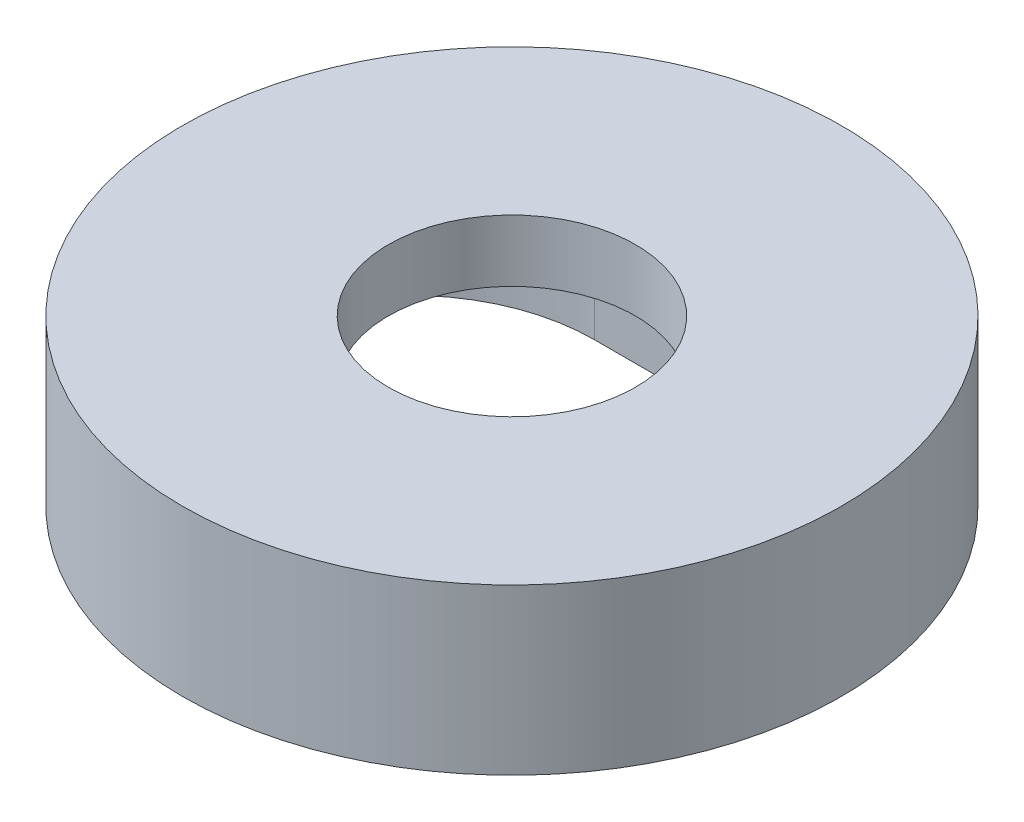
ISO-10303-21;
HEADER;
FILE_DESCRIPTION(('STEP AP214'),'2;1');
FILE_NAME('part.step','',(''),(''),'','','');
FILE_SCHEMA(('AUTOMOTIVE_DESIGN { 1 0 10303 214 1 1 1 1 }'));
ENDSEC;
DATA;
#1=APPLICATION_CONTEXT('core data for automotive mechanical design processes');
#2=APPLICATION_PROTOCOL_DEFINITION('international standard','automotive_design',2000,#1);
#3=PRODUCT_CONTEXT('',#1,'mechanical');
#4=PRODUCT('Part','Part','',(#3));
#5=PRODUCT_RELATED_PRODUCT_CATEGORY('part','',(#4));
#6=PRODUCT_DEFINITION_FORMATION('','',#4);
#7=PRODUCT_DEFINITION_CONTEXT('part definition',#1,'design');
#8=PRODUCT_DEFINITION('design','',#6,#7);
#9=PRODUCT_DEFINITION_SHAPE('','',#8);
#10=(LENGTH_UNIT() NAMED_UNIT(*) SI_UNIT(.MILLI.,.METRE.));
#11=(NAMED_UNIT(*) PLANE_ANGLE_UNIT() SI_UNIT($,.RADIAN.));
#12=(NAMED_UNIT(*) SI_UNIT($,.STERADIAN.) SOLID_ANGLE_UNIT());
#13=UNCERTAINTY_MEASURE_WITH_UNIT(LENGTH_MEASURE(1.E-05),#10,'distance_accuracy_value','');
#14=(GEOMETRIC_REPRESENTATION_CONTEXT(3) GLOBAL_UNCERTAINTY_ASSIGNED_CONTEXT((#13)) GLOBAL_UNIT_ASSIGNED_CONTEXT((#10,
#11,#12)) REPRESENTATION_CONTEXT('',''));
#15=CARTESIAN_POINT('',(0.,0.,0.));
#16=DIRECTION('',(0.,0.,1.));
#17=DIRECTION('',(1.,0.,0.));
#18=AXIS2_PLACEMENT_3D('',#15,#16,#17);
#19=CARTESIAN_POINT('',(0.,0.,0.));
#20=DIRECTION('',(0.,1.,0.));
#21=DIRECTION('',(0.,0.,1.));
#22=AXIS2_PLACEMENT_3D('',#19,#20,#21);
#23=PLANE('',#22);
#24=CARTESIAN_POINT('',(0.,0.,0.));
#25=DIRECTION('',(0.,1.,0.));
#26=DIRECTION('',(0.,0.,1.));
#27=AXIS2_PLACEMENT_3D('',#24,#25,#26);
#28=CIRCLE('',#27,16.);
#29=CARTESIAN_POINT('',(0.,0.,16.));
#30=VERTEX_POINT('',#29);
#31=EDGE_CURVE('E44',#30,#30,#28,.T.);
#32=ORIENTED_EDGE('',*,*,#31,.F.);
#33=EDGE_LOOP('',(#32));
#34=FACE_BOUND('',#33,.T.);
#35=CARTESIAN_POINT('',(-5.,0.,0.));
#36=DIRECTION('',(0.,1.,0.));
#37=DIRECTION('',(0.,0.,1.));
#38=AXIS2_PLACEMENT_3D('',#35,#36,#37);
#39=CIRCLE('',#38,9.);
#40=CARTESIAN_POINT('',(-5.,0.,-9.));
#41=VERTEX_POINT('',#40);
#42=CARTESIAN_POINT('',(-5.,0.,9.));
#43=VERTEX_POINT('',#42);
#44=EDGE_CURVE('E52',#41,#43,#39,.T.);
#45=ORIENTED_EDGE('',*,*,#44,.T.);
#46=DIRECTION('',(1.,0.,0.));
#47=VECTOR('',#46,1.);
#48=CARTESIAN_POINT('',(-5.,0.,9.));
#49=LINE('',#48,#47);
#50=CARTESIAN_POINT('',(5.,0.,9.));
#51=VERTEX_POINT('',#50);
#52=EDGE_CURVE('E107',#43,#51,#49,.T.);
#53=ORIENTED_EDGE('',*,*,#52,.T.);
#54=CARTESIAN_POINT('',(5.,0.,0.));
#55=DIRECTION('',(0.,1.,0.));
#56=DIRECTION('',(0.,0.,1.));
#57=AXIS2_PLACEMENT_3D('',#54,#55,#56);
#58=CIRCLE('',#57,9.);
#59=CARTESIAN_POINT('',(5.,0.,-9.));
#60=VERTEX_POINT('',#59);
#61=EDGE_CURVE('E97',#51,#60,#58,.T.);
#62=ORIENTED_EDGE('',*,*,#61,.T.);
#63=DIRECTION('',(-1.,0.,0.));
#64=VECTOR('',#63,1.);
#65=CARTESIAN_POINT('',(-5.,0.,-9.));
#66=LINE('',#65,#64);
#67=EDGE_CURVE('E110',#60,#41,#66,.T.);
#68=ORIENTED_EDGE('',*,*,#67,.T.);
#69=EDGE_LOOP('',(#45,#53,#62,#68));
#70=FACE_BOUND('',#69,.T.);
#71=ADVANCED_FACE('F35',(#34,#70),#23,.F.);
#72=CARTESIAN_POINT('',(0.,8.,0.));
#73=DIRECTION('',(0.,-1.,0.));
#74=DIRECTION('',(0.,0.,-1.));
#75=AXIS2_PLACEMENT_3D('',#72,#73,#74);
#76=CYLINDRICAL_SURFACE('',#75,16.);
#77=CARTESIAN_POINT('',(0.,8.,0.));
#78=DIRECTION('',(0.,1.,0.));
#79=DIRECTION('',(0.,0.,1.));
#80=AXIS2_PLACEMENT_3D('',#77,#78,#79);
#81=CIRCLE('',#80,16.);
#82=CARTESIAN_POINT('',(0.,8.,16.));
#83=VERTEX_POINT('',#82);
#84=EDGE_CURVE('E11',#83,#83,#81,.T.);
#85=ORIENTED_EDGE('',*,*,#84,.F.);
#86=EDGE_LOOP('',(#85));
#87=FACE_BOUND('',#86,.T.);
#88=ORIENTED_EDGE('',*,*,#31,.T.);
#89=EDGE_LOOP('',(#88));
#90=FACE_BOUND('',#89,.T.);
#91=ADVANCED_FACE('F37',(#87,#90),#76,.T.);
#92=CARTESIAN_POINT('',(0.,8.,0.));
#93=DIRECTION('',(0.,1.,0.));
#94=DIRECTION('',(0.,0.,1.));
#95=AXIS2_PLACEMENT_3D('',#92,#93,#94);
#96=PLANE('',#95);
#97=CARTESIAN_POINT('',(0.,8.,0.));
#98=DIRECTION('',(0.,1.,0.));
#99=DIRECTION('',(0.,0.,1.));
#100=AXIS2_PLACEMENT_3D('',#97,#98,#99);
#101=CIRCLE('',#100,6.);
#102=CARTESIAN_POINT('',(0.,8.,6.));
#103=VERTEX_POINT('',#102);
#104=EDGE_CURVE('E124',#103,#103,#101,.T.);
#105=ORIENTED_EDGE('',*,*,#104,.F.);
#106=EDGE_LOOP('',(#105));
#107=FACE_BOUND('',#106,.T.);
#108=ORIENTED_EDGE('',*,*,#84,.T.);
#109=EDGE_LOOP('',(#108));
#110=FACE_BOUND('',#109,.T.);
#111=ADVANCED_FACE('F148',(#107,#110),#96,.T.);
#112=CARTESIAN_POINT('',(-5.,5.,0.));
#113=DIRECTION('',(0.,-1.,0.));
#114=DIRECTION('',(0.,0.,-1.));
#115=AXIS2_PLACEMENT_3D('',#112,#113,#114);
#116=CYLINDRICAL_SURFACE('',#115,9.);
#117=ORIENTED_EDGE('',*,*,#44,.F.);
#118=DIRECTION('',(0.,-1.,0.));
#119=VECTOR('',#118,1.);
#120=CARTESIAN_POINT('',(-5.,5.,-9.));
#121=LINE('',#120,#119);
#122=CARTESIAN_POINT('',(-5.,5.,-9.));
#123=VERTEX_POINT('',#122);
#124=EDGE_CURVE('E102',#123,#41,#121,.T.);
#125=ORIENTED_EDGE('',*,*,#124,.F.);
#126=CARTESIAN_POINT('',(-5.,5.,0.));
#127=DIRECTION('',(0.,1.,0.));
#128=DIRECTION('',(0.,0.,1.));
#129=AXIS2_PLACEMENT_3D('',#126,#127,#128);
#130=CIRCLE('',#129,9.);
#131=CARTESIAN_POINT('',(-5.,5.,9.));
#132=VERTEX_POINT('',#131);
#133=EDGE_CURVE('E93',#123,#132,#130,.T.);
#134=ORIENTED_EDGE('',*,*,#133,.T.);
#135=DIRECTION('',(0.,-1.,0.));
#136=VECTOR('',#135,1.);
#137=CARTESIAN_POINT('',(-5.,5.,9.));
#138=LINE('',#137,#136);
#139=EDGE_CURVE('E91',#132,#43,#138,.T.);
#140=ORIENTED_EDGE('',*,*,#139,.T.);
#141=EDGE_LOOP('',(#117,#125,#134,#140));
#142=FACE_BOUND('',#141,.T.);
#143=ADVANCED_FACE('F122',(#142),#116,.F.);
#144=CARTESIAN_POINT('',(-5.,5.,9.));
#145=DIRECTION('',(0.,0.,-1.));
#146=DIRECTION('',(-1.,0.,0.));
#147=AXIS2_PLACEMENT_3D('',#144,#145,#146);
#148=PLANE('',#147);
#149=ORIENTED_EDGE('',*,*,#52,.F.);
#150=ORIENTED_EDGE('',*,*,#139,.F.);
#151=DIRECTION('',(1.,0.,0.));
#152=VECTOR('',#151,1.);
#153=CARTESIAN_POINT('',(-5.,5.,9.));
#154=LINE('',#153,#152);
#155=CARTESIAN_POINT('',(5.,5.,9.));
#156=VERTEX_POINT('',#155);
#157=EDGE_CURVE('E84',#132,#156,#154,.T.);
#158=ORIENTED_EDGE('',*,*,#157,.T.);
#159=DIRECTION('',(0.,-1.,0.));
#160=VECTOR('',#159,1.);
#161=CARTESIAN_POINT('',(5.,5.,9.));
#162=LINE('',#161,#160);
#163=EDGE_CURVE('E90',#156,#51,#162,.T.);
#164=ORIENTED_EDGE('',*,*,#163,.T.);
#165=EDGE_LOOP('',(#149,#150,#158,#164));
#166=FACE_BOUND('',#165,.T.);
#167=ADVANCED_FACE('F89',(#166),#148,.T.);
#168=CARTESIAN_POINT('',(5.,5.,0.));
#169=DIRECTION('',(0.,-1.,0.));
#170=DIRECTION('',(0.,0.,-1.));
#171=AXIS2_PLACEMENT_3D('',#168,#169,#170);
#172=CYLINDRICAL_SURFACE('',#171,9.);
#173=ORIENTED_EDGE('',*,*,#61,.F.);
#174=ORIENTED_EDGE('',*,*,#163,.F.);
#175=CARTESIAN_POINT('',(5.,5.,0.));
#176=DIRECTION('',(0.,1.,0.));
#177=DIRECTION('',(0.,0.,1.));
#178=AXIS2_PLACEMENT_3D('',#175,#176,#177);
#179=CIRCLE('',#178,9.);
#180=CARTESIAN_POINT('',(5.,5.,-9.));
#181=VERTEX_POINT('',#180);
#182=EDGE_CURVE('E92',#156,#181,#179,.T.);
#183=ORIENTED_EDGE('',*,*,#182,.T.);
#184=DIRECTION('',(0.,-1.,0.));
#185=VECTOR('',#184,1.);
#186=CARTESIAN_POINT('',(5.,5.,-9.));
#187=LINE('',#186,#185);
#188=EDGE_CURVE('E76',#181,#60,#187,.T.);
#189=ORIENTED_EDGE('',*,*,#188,.T.);
#190=EDGE_LOOP('',(#173,#174,#183,#189));
#191=FACE_BOUND('',#190,.T.);
#192=ADVANCED_FACE('F95',(#191),#172,.F.);
#193=CARTESIAN_POINT('',(-5.,5.,-9.));
#194=DIRECTION('',(0.,0.,1.));
#195=DIRECTION('',(1.,0.,0.));
#196=AXIS2_PLACEMENT_3D('',#193,#194,#195);
#197=PLANE('',#196);
#198=ORIENTED_EDGE('',*,*,#67,.F.);
#199=ORIENTED_EDGE('',*,*,#188,.F.);
#200=DIRECTION('',(-1.,0.,0.));
#201=VECTOR('',#200,1.);
#202=CARTESIAN_POINT('',(-5.,5.,-9.));
#203=LINE('',#202,#201);
#204=EDGE_CURVE('E60',#181,#123,#203,.T.);
#205=ORIENTED_EDGE('',*,*,#204,.T.);
#206=ORIENTED_EDGE('',*,*,#124,.T.);
#207=EDGE_LOOP('',(#198,#199,#205,#206));
#208=FACE_BOUND('',#207,.T.);
#209=ADVANCED_FACE('F121',(#208),#197,.T.);
#210=CARTESIAN_POINT('',(-5.,5.,0.));
#211=DIRECTION('',(0.,1.,0.));
#212=DIRECTION('',(0.,0.,1.));
#213=AXIS2_PLACEMENT_3D('',#210,#211,#212);
#214=PLANE('',#213);
#215=CARTESIAN_POINT('',(0.,5.,0.));
#216=DIRECTION('',(0.,1.,0.));
#217=DIRECTION('',(0.,0.,1.));
#218=AXIS2_PLACEMENT_3D('',#215,#216,#217);
#219=CIRCLE('',#218,6.);
#220=CARTESIAN_POINT('',(0.,5.,6.));
#221=VERTEX_POINT('',#220);
#222=EDGE_CURVE('E39',#221,#221,#219,.T.);
#223=ORIENTED_EDGE('',*,*,#222,.T.);
#224=EDGE_LOOP('',(#223));
#225=FACE_BOUND('',#224,.T.);
#226=ORIENTED_EDGE('',*,*,#133,.F.);
#227=ORIENTED_EDGE('',*,*,#204,.F.);
#228=ORIENTED_EDGE('',*,*,#182,.F.);
#229=ORIENTED_EDGE('',*,*,#157,.F.);
#230=EDGE_LOOP('',(#226,#227,#228,#229));
#231=FACE_BOUND('',#230,.T.);
#232=ADVANCED_FACE('F100',(#225,#231),#214,.F.);
#233=CARTESIAN_POINT('',(0.,0.,0.));
#234=DIRECTION('',(0.,1.,0.));
#235=DIRECTION('',(0.,0.,1.));
#236=AXIS2_PLACEMENT_3D('',#233,#234,#235);
#237=CYLINDRICAL_SURFACE('',#236,6.);
#238=ORIENTED_EDGE('',*,*,#104,.T.);
#239=EDGE_LOOP('',(#238));
#240=FACE_BOUND('',#239,.T.);
#241=ORIENTED_EDGE('',*,*,#222,.F.);
#242=EDGE_LOOP('',(#241));
#243=FACE_BOUND('',#242,.T.);
#244=ADVANCED_FACE('F132',(#240,#243),#237,.F.);
#245=CLOSED_SHELL('',(#71,#91,#111,#143,#167,#192,#209,#232,#244));
#246=MANIFOLD_SOLID_BREP('B2',#245);
#247=ADVANCED_BREP_SHAPE_REPRESENTATION('',(#18,#246),#14);
#248=SHAPE_DEFINITION_REPRESENTATION(#9,#247);
ENDSEC;
END-ISO-10303-21;
